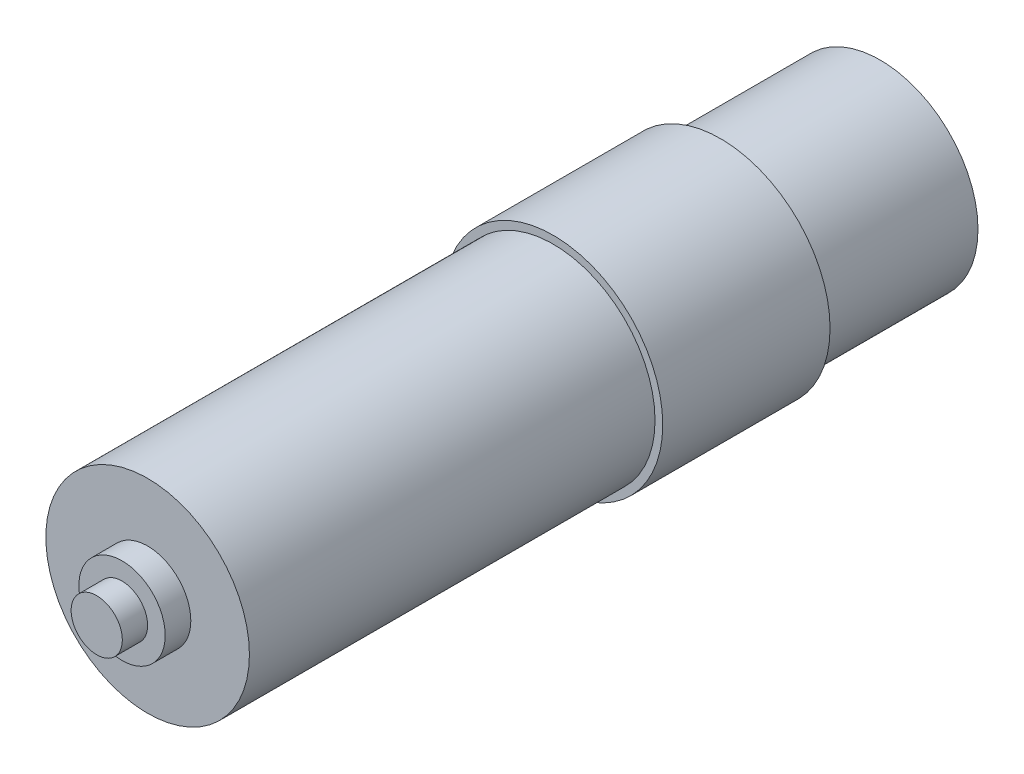
ISO-10303-21;
HEADER;
FILE_DESCRIPTION(('STEP AP214'),'2;1');
FILE_NAME('part.step','',(''),(''),'','','');
FILE_SCHEMA(('AUTOMOTIVE_DESIGN { 1 0 10303 214 1 1 1 1 }'));
ENDSEC;
DATA;
#1=APPLICATION_CONTEXT('core data for automotive mechanical design processes');
#2=APPLICATION_PROTOCOL_DEFINITION('international standard','automotive_design',2000,#1);
#3=PRODUCT_CONTEXT('',#1,'mechanical');
#4=PRODUCT('Part','Part','',(#3));
#5=PRODUCT_RELATED_PRODUCT_CATEGORY('part','',(#4));
#6=PRODUCT_DEFINITION_FORMATION('','',#4);
#7=PRODUCT_DEFINITION_CONTEXT('part definition',#1,'design');
#8=PRODUCT_DEFINITION('design','',#6,#7);
#9=PRODUCT_DEFINITION_SHAPE('','',#8);
#10=(LENGTH_UNIT() NAMED_UNIT(*) SI_UNIT(.MILLI.,.METRE.));
#11=(NAMED_UNIT(*) PLANE_ANGLE_UNIT() SI_UNIT($,.RADIAN.));
#12=(NAMED_UNIT(*) SI_UNIT($,.STERADIAN.) SOLID_ANGLE_UNIT());
#13=UNCERTAINTY_MEASURE_WITH_UNIT(LENGTH_MEASURE(1.E-05),#10,'distance_accuracy_value','');
#14=(GEOMETRIC_REPRESENTATION_CONTEXT(3) GLOBAL_UNCERTAINTY_ASSIGNED_CONTEXT((#13)) GLOBAL_UNIT_ASSIGNED_CONTEXT((#10,
#11,#12)) REPRESENTATION_CONTEXT('',''));
#15=CARTESIAN_POINT('',(0.,0.,0.));
#16=DIRECTION('',(0.,0.,1.));
#17=DIRECTION('',(1.,0.,0.));
#18=AXIS2_PLACEMENT_3D('',#15,#16,#17);
#19=CARTESIAN_POINT('',(0.,0.,0.));
#20=DIRECTION('',(0.,0.,1.));
#21=DIRECTION('',(1.,0.,0.));
#22=AXIS2_PLACEMENT_3D('',#19,#20,#21);
#23=PLANE('',#22);
#24=CARTESIAN_POINT('',(0.,0.,0.));
#25=DIRECTION('',(0.,0.,1.));
#26=DIRECTION('',(1.,0.,0.));
#27=AXIS2_PLACEMENT_3D('',#24,#25,#26);
#28=CIRCLE('',#27,15.85);
#29=CARTESIAN_POINT('',(15.85,0.,0.));
#30=VERTEX_POINT('',#29);
#31=EDGE_CURVE('E10',#30,#30,#28,.T.);
#32=ORIENTED_EDGE('',*,*,#31,.F.);
#33=EDGE_LOOP('',(#32));
#34=FACE_BOUND('',#33,.T.);
#35=ADVANCED_FACE('F35',(#34),#23,.F.);
#36=CARTESIAN_POINT('',(0.,0.,0.));
#37=DIRECTION('',(0.,0.,1.));
#38=DIRECTION('',(1.,0.,0.));
#39=AXIS2_PLACEMENT_3D('',#36,#37,#38);
#40=CYLINDRICAL_SURFACE('',#39,15.85);
#41=CARTESIAN_POINT('',(0.,0.,25.88));
#42=DIRECTION('',(0.,0.,1.));
#43=DIRECTION('',(1.,0.,0.));
#44=AXIS2_PLACEMENT_3D('',#41,#42,#43);
#45=CIRCLE('',#44,15.85);
#46=CARTESIAN_POINT('',(15.85,0.,25.88));
#47=VERTEX_POINT('',#46);
#48=EDGE_CURVE('E41',#47,#47,#45,.T.);
#49=ORIENTED_EDGE('',*,*,#48,.F.);
#50=EDGE_LOOP('',(#49));
#51=FACE_BOUND('',#50,.T.);
#52=ORIENTED_EDGE('',*,*,#31,.T.);
#53=EDGE_LOOP('',(#52));
#54=FACE_BOUND('',#53,.T.);
#55=ADVANCED_FACE('F119',(#51,#54),#40,.T.);
#56=CARTESIAN_POINT('',(0.,15.85,25.88));
#57=DIRECTION('',(0.,0.,1.));
#58=DIRECTION('',(1.,0.,0.));
#59=AXIS2_PLACEMENT_3D('',#56,#57,#58);
#60=PLANE('',#59);
#61=CARTESIAN_POINT('',(0.,0.,25.88));
#62=DIRECTION('',(0.,0.,1.));
#63=DIRECTION('',(1.,0.,0.));
#64=AXIS2_PLACEMENT_3D('',#61,#62,#63);
#65=CIRCLE('',#64,17.75);
#66=CARTESIAN_POINT('',(17.75,0.,25.88));
#67=VERTEX_POINT('',#66);
#68=EDGE_CURVE('E45',#67,#67,#65,.T.);
#69=ORIENTED_EDGE('',*,*,#68,.F.);
#70=EDGE_LOOP('',(#69));
#71=FACE_BOUND('',#70,.T.);
#72=ORIENTED_EDGE('',*,*,#48,.T.);
#73=EDGE_LOOP('',(#72));
#74=FACE_BOUND('',#73,.T.);
#75=ADVANCED_FACE('F114',(#71,#74),#60,.F.);
#76=CARTESIAN_POINT('',(0.,0.,0.));
#77=DIRECTION('',(0.,0.,1.));
#78=DIRECTION('',(1.,0.,0.));
#79=AXIS2_PLACEMENT_3D('',#76,#77,#78);
#80=CYLINDRICAL_SURFACE('',#79,17.75);
#81=CARTESIAN_POINT('',(0.,0.,53.));
#82=DIRECTION('',(0.,0.,1.));
#83=DIRECTION('',(1.,0.,0.));
#84=AXIS2_PLACEMENT_3D('',#81,#82,#83);
#85=CIRCLE('',#84,17.75);
#86=CARTESIAN_POINT('',(17.75,0.,53.));
#87=VERTEX_POINT('',#86);
#88=EDGE_CURVE('E49',#87,#87,#85,.T.);
#89=ORIENTED_EDGE('',*,*,#88,.F.);
#90=EDGE_LOOP('',(#89));
#91=FACE_BOUND('',#90,.T.);
#92=ORIENTED_EDGE('',*,*,#68,.T.);
#93=EDGE_LOOP('',(#92));
#94=FACE_BOUND('',#93,.T.);
#95=ADVANCED_FACE('F108',(#91,#94),#80,.T.);
#96=CARTESIAN_POINT('',(0.,17.75,53.));
#97=DIRECTION('',(0.,0.,-1.));
#98=DIRECTION('',(-1.,0.,0.));
#99=AXIS2_PLACEMENT_3D('',#96,#97,#98);
#100=PLANE('',#99);
#101=CARTESIAN_POINT('',(0.,0.,53.));
#102=DIRECTION('',(0.,0.,1.));
#103=DIRECTION('',(1.,0.,0.));
#104=AXIS2_PLACEMENT_3D('',#101,#102,#103);
#105=CIRCLE('',#104,16.5);
#106=CARTESIAN_POINT('',(16.5,0.,53.));
#107=VERTEX_POINT('',#106);
#108=EDGE_CURVE('E54',#107,#107,#105,.T.);
#109=ORIENTED_EDGE('',*,*,#108,.F.);
#110=EDGE_LOOP('',(#109));
#111=FACE_BOUND('',#110,.T.);
#112=ORIENTED_EDGE('',*,*,#88,.T.);
#113=EDGE_LOOP('',(#112));
#114=FACE_BOUND('',#113,.T.);
#115=ADVANCED_FACE('F102',(#111,#114),#100,.F.);
#116=CARTESIAN_POINT('',(0.,0.,0.));
#117=DIRECTION('',(0.,0.,1.));
#118=DIRECTION('',(1.,0.,0.));
#119=AXIS2_PLACEMENT_3D('',#116,#117,#118);
#120=CYLINDRICAL_SURFACE('',#119,16.5);
#121=CARTESIAN_POINT('',(0.,0.,118.75));
#122=DIRECTION('',(0.,0.,1.));
#123=DIRECTION('',(1.,0.,0.));
#124=AXIS2_PLACEMENT_3D('',#121,#122,#123);
#125=CIRCLE('',#124,16.5);
#126=CARTESIAN_POINT('',(16.5,0.,118.75));
#127=VERTEX_POINT('',#126);
#128=EDGE_CURVE('E57',#127,#127,#125,.T.);
#129=ORIENTED_EDGE('',*,*,#128,.F.);
#130=EDGE_LOOP('',(#129));
#131=FACE_BOUND('',#130,.T.);
#132=ORIENTED_EDGE('',*,*,#108,.T.);
#133=EDGE_LOOP('',(#132));
#134=FACE_BOUND('',#133,.T.);
#135=ADVANCED_FACE('F96',(#131,#134),#120,.T.);
#136=CARTESIAN_POINT('',(0.,16.5,118.75));
#137=DIRECTION('',(0.,0.,-1.));
#138=DIRECTION('',(-1.,0.,0.));
#139=AXIS2_PLACEMENT_3D('',#136,#137,#138);
#140=PLANE('',#139);
#141=CARTESIAN_POINT('',(0.,0.,118.75));
#142=DIRECTION('',(0.,0.,1.));
#143=DIRECTION('',(1.,0.,0.));
#144=AXIS2_PLACEMENT_3D('',#141,#142,#143);
#145=CIRCLE('',#144,7.);
#146=CARTESIAN_POINT('',(7.,0.,118.75));
#147=VERTEX_POINT('',#146);
#148=EDGE_CURVE('E60',#147,#147,#145,.T.);
#149=ORIENTED_EDGE('',*,*,#148,.F.);
#150=EDGE_LOOP('',(#149));
#151=FACE_BOUND('',#150,.T.);
#152=ORIENTED_EDGE('',*,*,#128,.T.);
#153=EDGE_LOOP('',(#152));
#154=FACE_BOUND('',#153,.T.);
#155=ADVANCED_FACE('F90',(#151,#154),#140,.F.);
#156=CARTESIAN_POINT('',(0.,0.,0.));
#157=DIRECTION('',(0.,0.,1.));
#158=DIRECTION('',(1.,0.,0.));
#159=AXIS2_PLACEMENT_3D('',#156,#157,#158);
#160=CYLINDRICAL_SURFACE('',#159,7.);
#161=CARTESIAN_POINT('',(0.,0.,122.9));
#162=DIRECTION('',(0.,0.,1.));
#163=DIRECTION('',(1.,0.,0.));
#164=AXIS2_PLACEMENT_3D('',#161,#162,#163);
#165=CIRCLE('',#164,7.);
#166=CARTESIAN_POINT('',(7.,0.,122.9));
#167=VERTEX_POINT('',#166);
#168=EDGE_CURVE('E63',#167,#167,#165,.T.);
#169=ORIENTED_EDGE('',*,*,#168,.F.);
#170=EDGE_LOOP('',(#169));
#171=FACE_BOUND('',#170,.T.);
#172=ORIENTED_EDGE('',*,*,#148,.T.);
#173=EDGE_LOOP('',(#172));
#174=FACE_BOUND('',#173,.T.);
#175=ADVANCED_FACE('F84',(#171,#174),#160,.T.);
#176=CARTESIAN_POINT('',(0.,7.,122.9));
#177=DIRECTION('',(0.,0.,-1.));
#178=DIRECTION('',(-1.,0.,0.));
#179=AXIS2_PLACEMENT_3D('',#176,#177,#178);
#180=PLANE('',#179);
#181=CARTESIAN_POINT('',(0.,0.,122.9));
#182=DIRECTION('',(0.,0.,1.));
#183=DIRECTION('',(1.,0.,0.));
#184=AXIS2_PLACEMENT_3D('',#181,#182,#183);
#185=CIRCLE('',#184,4.15);
#186=CARTESIAN_POINT('',(4.15,0.,122.9));
#187=VERTEX_POINT('',#186);
#188=EDGE_CURVE('E66',#187,#187,#185,.T.);
#189=ORIENTED_EDGE('',*,*,#188,.F.);
#190=EDGE_LOOP('',(#189));
#191=FACE_BOUND('',#190,.T.);
#192=ORIENTED_EDGE('',*,*,#168,.T.);
#193=EDGE_LOOP('',(#192));
#194=FACE_BOUND('',#193,.T.);
#195=ADVANCED_FACE('F78',(#191,#194),#180,.F.);
#196=CARTESIAN_POINT('',(0.,0.,0.));
#197=DIRECTION('',(0.,0.,1.));
#198=DIRECTION('',(1.,0.,0.));
#199=AXIS2_PLACEMENT_3D('',#196,#197,#198);
#200=CYLINDRICAL_SURFACE('',#199,4.15);
#201=CARTESIAN_POINT('',(0.,0.,127.));
#202=DIRECTION('',(0.,0.,1.));
#203=DIRECTION('',(1.,0.,0.));
#204=AXIS2_PLACEMENT_3D('',#201,#202,#203);
#205=CIRCLE('',#204,4.15);
#206=CARTESIAN_POINT('',(4.15,0.,127.));
#207=VERTEX_POINT('',#206);
#208=EDGE_CURVE('E69',#207,#207,#205,.T.);
#209=ORIENTED_EDGE('',*,*,#208,.F.);
#210=EDGE_LOOP('',(#209));
#211=FACE_BOUND('',#210,.T.);
#212=ORIENTED_EDGE('',*,*,#188,.T.);
#213=EDGE_LOOP('',(#212));
#214=FACE_BOUND('',#213,.T.);
#215=ADVANCED_FACE('F75',(#211,#214),#200,.T.);
#216=CARTESIAN_POINT('',(0.,4.15,127.));
#217=DIRECTION('',(0.,0.,-1.));
#218=DIRECTION('',(-1.,0.,0.));
#219=AXIS2_PLACEMENT_3D('',#216,#217,#218);
#220=PLANE('',#219);
#221=ORIENTED_EDGE('',*,*,#208,.T.);
#222=EDGE_LOOP('',(#221));
#223=FACE_BOUND('',#222,.T.);
#224=ADVANCED_FACE('F73',(#223),#220,.F.);
#225=CLOSED_SHELL('',(#35,#55,#75,#95,#115,#135,#155,#175,#195,#215,#224));
#226=MANIFOLD_SOLID_BREP('B2',#225);
#227=ADVANCED_BREP_SHAPE_REPRESENTATION('',(#18,#226),#14);
#228=SHAPE_DEFINITION_REPRESENTATION(#9,#227);
ENDSEC;
END-ISO-10303-21;
